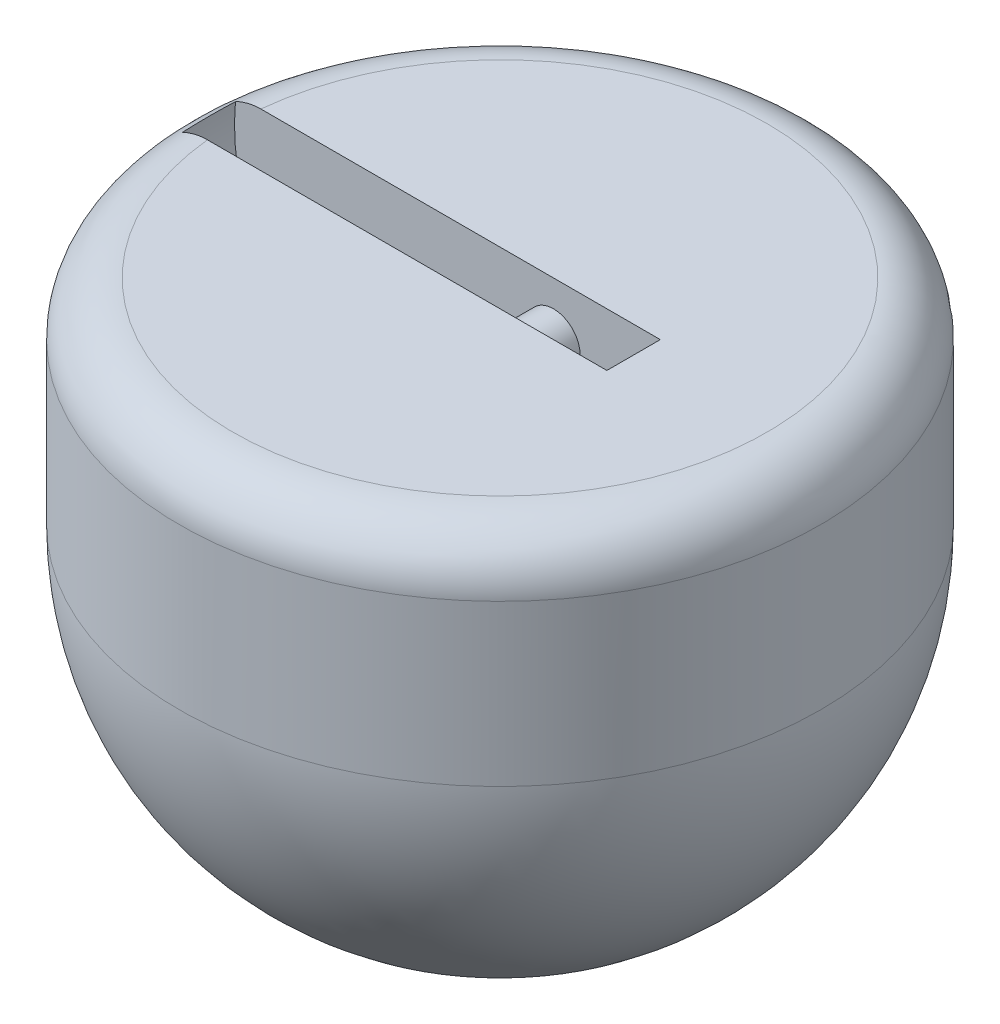
ISO-10303-21;
HEADER;
FILE_DESCRIPTION(('STEP AP214'),'2;1');
FILE_NAME('part.step','',(''),(''),'','','');
FILE_SCHEMA(('AUTOMOTIVE_DESIGN { 1 0 10303 214 1 1 1 1 }'));
ENDSEC;
DATA;
#1=APPLICATION_CONTEXT('core data for automotive mechanical design processes');
#2=APPLICATION_PROTOCOL_DEFINITION('international standard','automotive_design',2000,#1);
#3=PRODUCT_CONTEXT('',#1,'mechanical');
#4=PRODUCT('Part','Part','',(#3));
#5=PRODUCT_RELATED_PRODUCT_CATEGORY('part','',(#4));
#6=PRODUCT_DEFINITION_FORMATION('','',#4);
#7=PRODUCT_DEFINITION_CONTEXT('part definition',#1,'design');
#8=PRODUCT_DEFINITION('design','',#6,#7);
#9=PRODUCT_DEFINITION_SHAPE('','',#8);
#10=(LENGTH_UNIT() NAMED_UNIT(*) SI_UNIT(.MILLI.,.METRE.));
#11=(NAMED_UNIT(*) PLANE_ANGLE_UNIT() SI_UNIT($,.RADIAN.));
#12=(NAMED_UNIT(*) SI_UNIT($,.STERADIAN.) SOLID_ANGLE_UNIT());
#13=UNCERTAINTY_MEASURE_WITH_UNIT(LENGTH_MEASURE(1.E-05),#10,'distance_accuracy_value','');
#14=(GEOMETRIC_REPRESENTATION_CONTEXT(3) GLOBAL_UNCERTAINTY_ASSIGNED_CONTEXT((#13)) GLOBAL_UNIT_ASSIGNED_CONTEXT((#10,
#11,#12)) REPRESENTATION_CONTEXT('',''));
#15=CARTESIAN_POINT('',(0.,0.,0.));
#16=DIRECTION('',(0.,0.,1.));
#17=DIRECTION('',(1.,0.,0.));
#18=AXIS2_PLACEMENT_3D('',#15,#16,#17);
#19=CARTESIAN_POINT('',(0.,0.,0.));
#20=DIRECTION('',(0.,1.,0.));
#21=DIRECTION('',(0.,0.,1.));
#22=AXIS2_PLACEMENT_3D('',#19,#20,#21);
#23=PLANE('',#22);
#24=DIRECTION('',(-1.,0.,0.));
#25=VECTOR('',#24,1.);
#26=CARTESIAN_POINT('',(5.,0.,-1.));
#27=LINE('',#26,#25);
#28=CARTESIAN_POINT('',(5.,0.,-1.));
#29=VERTEX_POINT('',#28);
#30=CARTESIAN_POINT('',(-9.9498743710665,0.,-1.));
#31=VERTEX_POINT('',#30);
#32=EDGE_CURVE('E56',#29,#31,#27,.T.);
#33=ORIENTED_EDGE('',*,*,#32,.F.);
#34=DIRECTION('',(0.,0.,1.));
#35=VECTOR('',#34,1.);
#36=CARTESIAN_POINT('',(5.,0.,-1.));
#37=LINE('',#36,#35);
#38=CARTESIAN_POINT('',(5.,0.,1.));
#39=VERTEX_POINT('',#38);
#40=EDGE_CURVE('E75',#29,#39,#37,.T.);
#41=ORIENTED_EDGE('',*,*,#40,.T.);
#42=DIRECTION('',(-1.,0.,0.));
#43=VECTOR('',#42,1.);
#44=CARTESIAN_POINT('',(5.,0.,1.));
#45=LINE('',#44,#43);
#46=CARTESIAN_POINT('',(-9.9498743710665,0.,1.));
#47=VERTEX_POINT('',#46);
#48=EDGE_CURVE('E72',#39,#47,#45,.T.);
#49=ORIENTED_EDGE('',*,*,#48,.T.);
#50=CARTESIAN_POINT('',(0.,0.,0.));
#51=DIRECTION('',(0.,-1.,0.));
#52=DIRECTION('',(0.,0.,-1.));
#53=AXIS2_PLACEMENT_3D('',#50,#51,#52);
#54=CIRCLE('',#53,10.);
#55=EDGE_CURVE('E83',#31,#47,#54,.T.);
#56=ORIENTED_EDGE('',*,*,#55,.F.);
#57=EDGE_LOOP('',(#33,#41,#49,#56));
#58=FACE_BOUND('',#57,.T.);
#59=ADVANCED_FACE('F34',(#58),#23,.T.);
#60=CARTESIAN_POINT('',(0.,-2.,0.));
#61=DIRECTION('',(0.,-1.,0.));
#62=DIRECTION('',(0.,0.,-1.));
#63=AXIS2_PLACEMENT_3D('',#60,#61,#62);
#64=TOROIDAL_SURFACE('',#63,10.,2.);
#65=CARTESIAN_POINT('',(-10.8242334275043,-0.199297555043121,-1.));
#66=CARTESIAN_POINT('',(-10.9257054604038,-0.248139179035854,-1.));
#67=CARTESIAN_POINT('',(-11.0231377750794,-0.305557934567899,-1.));
#68=CARTESIAN_POINT('',(-11.2070704624869,-0.43597230631444,-1.));
#69=CARTESIAN_POINT('',(-11.2935580682294,-0.508985851904782,-1.));
#70=CARTESIAN_POINT('',(-11.4530114356367,-0.668497793270508,-1.));
#71=CARTESIAN_POINT('',(-11.5259813733455,-0.754992009175932,-1.));
#72=CARTESIAN_POINT('',(-11.6562962836318,-0.939010720145789,-1.));
#73=CARTESIAN_POINT('',(-11.7136451079299,-1.03653248772297,-1.));
#74=CARTESIAN_POINT('',(-11.8109532091549,-1.23958249116003,-1.));
#75=CARTESIAN_POINT('',(-11.8509577064683,-1.34508905400909,-1.));
#76=CARTESIAN_POINT('',(-11.9126368483875,-1.56133441106516,-1.));
#77=CARTESIAN_POINT('',(-11.9343110800122,-1.67207332309768,-1.));
#78=CARTESIAN_POINT('',(-11.9586679257183,-1.89533704689153,-1.));
#79=CARTESIAN_POINT('',(-11.9613982703355,-2.0078566537947,-1.));
#80=CARTESIAN_POINT('',(-11.9479150153787,-2.23175421810235,-1.));
#81=CARTESIAN_POINT('',(-11.9317015890207,-2.34313218593625,-1.));
#82=CARTESIAN_POINT('',(-11.8808176377737,-2.56150613587524,-1.));
#83=CARTESIAN_POINT('',(-11.8461599659228,-2.66850511367036,-1.));
#84=CARTESIAN_POINT('',(-11.7593943517058,-2.87517577070994,-1.));
#85=CARTESIAN_POINT('',(-11.7072863890297,-2.97484744142617,-1.));
#86=CARTESIAN_POINT('',(-11.5870418223883,-3.16417294238195,-1.));
#87=CARTESIAN_POINT('',(-11.5188855627623,-3.25381428744889,-1.));
#88=CARTESIAN_POINT('',(-11.3685310366841,-3.42042364723295,-1.));
#89=CARTESIAN_POINT('',(-11.2863325809017,-3.4973914910464,-1.));
#90=CARTESIAN_POINT('',(-11.1099756084311,-3.63671625838457,-1.));
#91=CARTESIAN_POINT('',(-11.0157828277439,-3.69902980734676,-1.));
#92=CARTESIAN_POINT('',(-10.818305467045,-3.80703093379937,-1.));
#93=CARTESIAN_POINT('',(-10.7150207083925,-3.85271818452254,-1.));
#94=CARTESIAN_POINT('',(-10.5018541004647,-3.92636375685488,-1.));
#95=CARTESIAN_POINT('',(-10.3919477162282,-3.95425106105585,-1.));
#96=CARTESIAN_POINT('',(-10.1690193431008,-3.99125564685907,-1.));
#97=CARTESIAN_POINT('',(-10.055997282353,-4.00037249519023,-1.));
#98=CARTESIAN_POINT('',(-9.8295847785201,-3.99960269171912,-1.));
#99=CARTESIAN_POINT('',(-9.71619457980172,-3.9896432240721,-1.));
#100=CARTESIAN_POINT('',(-9.49268394558884,-3.95086958948949,-1.));
#101=CARTESIAN_POINT('',(-9.38256356668763,-3.92205509641406,-1.));
#102=CARTESIAN_POINT('',(-9.16849480489789,-3.84630422516719,-1.));
#103=CARTESIAN_POINT('',(-9.06455909718188,-3.79933201621416,-1.));
#104=CARTESIAN_POINT('',(-8.86606359963075,-3.68857952169498,-1.));
#105=CARTESIAN_POINT('',(-8.77150380402485,-3.62479924647412,-1.));
#106=CARTESIAN_POINT('',(-8.59462414757433,-3.48232359469526,-1.));
#107=CARTESIAN_POINT('',(-8.51228531731116,-3.40365177408854,-1.));
#108=CARTESIAN_POINT('',(-8.36207230372604,-3.23353367455121,-1.));
#109=CARTESIAN_POINT('',(-8.29419771704558,-3.14208775196457,-1.));
#110=CARTESIAN_POINT('',(-8.17525446281042,-2.94954629656905,-1.));
#111=CARTESIAN_POINT('',(-8.12409538838126,-2.84850662111941,-1.));
#112=CARTESIAN_POINT('',(-8.03960406066904,-2.63922988469286,-1.));
#113=CARTESIAN_POINT('',(-8.00627103040308,-2.53099313764558,-1.));
#114=CARTESIAN_POINT('',(-7.95860960077374,-2.31120849463868,-1.));
#115=CARTESIAN_POINT('',(-7.9441497273926,-2.19968909982976,-1.));
#116=CARTESIAN_POINT('',(-7.93424044725219,-1.97581043988159,-1.));
#117=CARTESIAN_POINT('',(-7.9387904693458,-1.86345120007649,-1.));
#118=CARTESIAN_POINT('',(-7.96670627296362,-1.64154862165487,-1.));
#119=CARTESIAN_POINT('',(-7.98999775721574,-1.53199592313294,-1.));
#120=CARTESIAN_POINT('',(-8.05460594024829,-1.31834308173638,-1.));
#121=CARTESIAN_POINT('',(-8.09592278107696,-1.21424298183803,-1.));
#122=CARTESIAN_POINT('',(-8.19546499470476,-1.01420355677668,-1.));
#123=CARTESIAN_POINT('',(-8.25372493878907,-0.918281440973528,-1.));
#124=CARTESIAN_POINT('',(-8.38542412717523,-0.737496379449116,-1.));
#125=CARTESIAN_POINT('',(-8.45886389885065,-0.652633818123036,-1.));
#126=CARTESIAN_POINT('',(-8.61934253200508,-0.495786961745805,-1.));
#127=CARTESIAN_POINT('',(-8.70646638718297,-0.423889631940541,-1.));
#128=CARTESIAN_POINT('',(-8.89147968023287,-0.295632238853413,-1.));
#129=CARTESIAN_POINT('',(-8.9893690871969,-0.239272130965685,-1.));
#130=CARTESIAN_POINT('',(-9.1938083834499,-0.143325437428456,-1.));
#131=CARTESIAN_POINT('',(-9.30040918537551,-0.103847319698298,-1.));
#132=CARTESIAN_POINT('',(-9.51874388838062,-0.0432767192851328,-1.));
#133=CARTESIAN_POINT('',(-9.63047915301714,-0.0221891506255669,-1.));
#134=CARTESIAN_POINT('',(-9.85629384700905,0.00103226072303266,-1.));
#135=CARTESIAN_POINT('',(-9.97038017747644,0.00309870617211501,-1.));
#136=CARTESIAN_POINT('',(-10.1971820534755,-0.0119856037720281,-1.));
#137=CARTESIAN_POINT('',(-10.3098990746798,-0.0291133887652928,-1.));
#138=CARTESIAN_POINT('',(-10.4899404810384,-0.0722563206126016,-1.));
#139=CARTESIAN_POINT('',(-10.5586606285797,-0.0926562173305354,-1.));
#140=CARTESIAN_POINT('',(-10.6935428790982,-0.140647066676178,-1.));
#141=CARTESIAN_POINT('',(-10.7597049815847,-0.168238020682936,-1.));
#142=CARTESIAN_POINT('',(-10.8242334275043,-0.199297555043121,-1.));
#143=B_SPLINE_CURVE_WITH_KNOTS('',3,(#65,#66,#67,#68,#69,#70,#71,#72,#73,#74,#75,#76,#77,#78,
#79,#80,#81,#82,#83,#84,#85,#86,#87,#88,#89,#90,#91,#92,#93,#94,#95,#96,#97,#98,#99,#100,#101,
#102,#103,#104,#105,#106,#107,#108,#109,#110,#111,#112,#113,#114,#115,#116,#117,#118,#119,#120,
#121,#122,#123,#124,#125,#126,#127,#128,#129,#130,#131,#132,#133,#134,#135,#136,#137,#138,#139,
#140,#141,#142),.UNSPECIFIED.,.T.,.F.,(4,2,2,2,2,2,2,2,2,2,2,2,2,2,2,2,2,2,2,2,2,2,2,2,2,2,2,2,
2,2,2,2,2,2,2,2,2,2,4),(0.,0.337584164204723,0.675558559432851,1.01342836870058,
1.35121479334807,1.68811516129069,2.02502311939836,2.36108190352256,2.69713761485192,
3.03295944879974,3.36878167360329,3.70501736664955,4.04125759350321,4.37848085670867,
4.7157107472202,5.05427782777901,5.39285272326164,5.73272256248192,6.07259828066687,
6.41314813076086,6.7536977712485,7.09371315366308,7.43371905296525,7.77185433704961,
8.1099748816469,8.44572721593102,8.78146946270047,9.11588723677842,9.45030764627263,
9.78541526441601,10.1205345267371,10.4578241791256,10.7951128631779,11.1345372256506,
11.4740522558177,11.814769823036,12.1550800767718,12.3697577242299,12.5844354128573),.UNSPECIFIED.);
#144=CARTESIAN_POINT('',(-10.9009037574159,-0.238237913015783,-1.));
#145=VERTEX_POINT('',#144);
#146=EDGE_CURVE('E69',#31,#145,#143,.T.);
#147=ORIENTED_EDGE('',*,*,#146,.F.);
#148=ORIENTED_EDGE('',*,*,#55,.T.);
#149=CARTESIAN_POINT('',(-10.8242334275043,-0.199297555043121,1.));
#150=CARTESIAN_POINT('',(-10.9257054604038,-0.248139179035854,1.));
#151=CARTESIAN_POINT('',(-11.0231377750794,-0.305557934567899,1.));
#152=CARTESIAN_POINT('',(-11.2070704624869,-0.43597230631444,1.));
#153=CARTESIAN_POINT('',(-11.2935580682294,-0.508985851904782,1.));
#154=CARTESIAN_POINT('',(-11.4530114356367,-0.668497793270508,1.));
#155=CARTESIAN_POINT('',(-11.5259813733455,-0.754992009175932,1.));
#156=CARTESIAN_POINT('',(-11.6562962836318,-0.939010720145789,1.));
#157=CARTESIAN_POINT('',(-11.7136451079299,-1.03653248772297,1.));
#158=CARTESIAN_POINT('',(-11.8109532091549,-1.23958249116003,1.));
#159=CARTESIAN_POINT('',(-11.8509577064683,-1.34508905400909,1.));
#160=CARTESIAN_POINT('',(-11.9126368483875,-1.56133441106516,1.));
#161=CARTESIAN_POINT('',(-11.9343110800122,-1.67207332309768,1.));
#162=CARTESIAN_POINT('',(-11.9586679257183,-1.89533704689153,1.));
#163=CARTESIAN_POINT('',(-11.9613982703355,-2.0078566537947,1.));
#164=CARTESIAN_POINT('',(-11.9479150153787,-2.23175421810235,1.));
#165=CARTESIAN_POINT('',(-11.9317015890207,-2.34313218593625,1.));
#166=CARTESIAN_POINT('',(-11.8808176377737,-2.56150613587524,1.));
#167=CARTESIAN_POINT('',(-11.8461599659228,-2.66850511367036,1.));
#168=CARTESIAN_POINT('',(-11.7593943517058,-2.87517577070994,1.));
#169=CARTESIAN_POINT('',(-11.7072863890297,-2.97484744142617,1.));
#170=CARTESIAN_POINT('',(-11.5870418223883,-3.16417294238195,1.));
#171=CARTESIAN_POINT('',(-11.5188855627623,-3.25381428744889,1.));
#172=CARTESIAN_POINT('',(-11.3685310366841,-3.42042364723295,1.));
#173=CARTESIAN_POINT('',(-11.2863325809017,-3.4973914910464,1.));
#174=CARTESIAN_POINT('',(-11.1099756084311,-3.63671625838457,1.));
#175=CARTESIAN_POINT('',(-11.0157828277439,-3.69902980734676,1.));
#176=CARTESIAN_POINT('',(-10.818305467045,-3.80703093379937,1.));
#177=CARTESIAN_POINT('',(-10.7150207083925,-3.85271818452254,1.));
#178=CARTESIAN_POINT('',(-10.5018541004647,-3.92636375685488,1.));
#179=CARTESIAN_POINT('',(-10.3919477162282,-3.95425106105585,1.));
#180=CARTESIAN_POINT('',(-10.1690193431008,-3.99125564685907,1.));
#181=CARTESIAN_POINT('',(-10.055997282353,-4.00037249519023,1.));
#182=CARTESIAN_POINT('',(-9.8295847785201,-3.99960269171912,1.));
#183=CARTESIAN_POINT('',(-9.71619457980172,-3.9896432240721,1.));
#184=CARTESIAN_POINT('',(-9.49268394558884,-3.95086958948949,1.));
#185=CARTESIAN_POINT('',(-9.38256356668763,-3.92205509641406,1.));
#186=CARTESIAN_POINT('',(-9.16849480489789,-3.84630422516719,1.));
#187=CARTESIAN_POINT('',(-9.06455909718188,-3.79933201621416,1.));
#188=CARTESIAN_POINT('',(-8.86606359963075,-3.68857952169498,1.));
#189=CARTESIAN_POINT('',(-8.77150380402485,-3.62479924647412,1.));
#190=CARTESIAN_POINT('',(-8.59462414757433,-3.48232359469526,1.));
#191=CARTESIAN_POINT('',(-8.51228531731116,-3.40365177408854,1.));
#192=CARTESIAN_POINT('',(-8.36207230372604,-3.23353367455121,1.));
#193=CARTESIAN_POINT('',(-8.29419771704558,-3.14208775196457,1.));
#194=CARTESIAN_POINT('',(-8.17525446281042,-2.94954629656905,1.));
#195=CARTESIAN_POINT('',(-8.12409538838126,-2.84850662111941,1.));
#196=CARTESIAN_POINT('',(-8.03960406066904,-2.63922988469286,1.));
#197=CARTESIAN_POINT('',(-8.00627103040308,-2.53099313764558,1.));
#198=CARTESIAN_POINT('',(-7.95860960077374,-2.31120849463868,1.));
#199=CARTESIAN_POINT('',(-7.9441497273926,-2.19968909982976,1.));
#200=CARTESIAN_POINT('',(-7.93424044725219,-1.97581043988159,1.));
#201=CARTESIAN_POINT('',(-7.9387904693458,-1.86345120007649,1.));
#202=CARTESIAN_POINT('',(-7.96670627296362,-1.64154862165487,1.));
#203=CARTESIAN_POINT('',(-7.98999775721574,-1.53199592313294,1.));
#204=CARTESIAN_POINT('',(-8.05460594024829,-1.31834308173638,1.));
#205=CARTESIAN_POINT('',(-8.09592278107696,-1.21424298183803,1.));
#206=CARTESIAN_POINT('',(-8.19546499470476,-1.01420355677668,1.));
#207=CARTESIAN_POINT('',(-8.25372493878907,-0.918281440973528,1.));
#208=CARTESIAN_POINT('',(-8.38542412717523,-0.737496379449116,1.));
#209=CARTESIAN_POINT('',(-8.45886389885065,-0.652633818123036,1.));
#210=CARTESIAN_POINT('',(-8.61934253200508,-0.495786961745805,1.));
#211=CARTESIAN_POINT('',(-8.70646638718297,-0.423889631940541,1.));
#212=CARTESIAN_POINT('',(-8.89147968023287,-0.295632238853413,1.));
#213=CARTESIAN_POINT('',(-8.9893690871969,-0.239272130965685,1.));
#214=CARTESIAN_POINT('',(-9.1938083834499,-0.143325437428456,1.));
#215=CARTESIAN_POINT('',(-9.30040918537551,-0.103847319698298,1.));
#216=CARTESIAN_POINT('',(-9.51874388838062,-0.0432767192851328,1.));
#217=CARTESIAN_POINT('',(-9.63047915301714,-0.0221891506255669,1.));
#218=CARTESIAN_POINT('',(-9.85629384700905,0.00103226072303266,1.));
#219=CARTESIAN_POINT('',(-9.97038017747644,0.00309870617211501,1.));
#220=CARTESIAN_POINT('',(-10.1971820534755,-0.0119856037720281,1.));
#221=CARTESIAN_POINT('',(-10.3098990746798,-0.0291133887652928,1.));
#222=CARTESIAN_POINT('',(-10.4899404810384,-0.0722563206126016,1.));
#223=CARTESIAN_POINT('',(-10.5586606285797,-0.0926562173305354,1.));
#224=CARTESIAN_POINT('',(-10.6935428790982,-0.140647066676178,1.));
#225=CARTESIAN_POINT('',(-10.7597049815847,-0.168238020682936,1.));
#226=CARTESIAN_POINT('',(-10.8242334275043,-0.199297555043121,1.));
#227=B_SPLINE_CURVE_WITH_KNOTS('',3,(#149,#150,#151,#152,#153,#154,#155,#156,#157,#158,#159,
#160,#161,#162,#163,#164,#165,#166,#167,#168,#169,#170,#171,#172,#173,#174,#175,#176,#177,#178,
#179,#180,#181,#182,#183,#184,#185,#186,#187,#188,#189,#190,#191,#192,#193,#194,#195,#196,#197,
#198,#199,#200,#201,#202,#203,#204,#205,#206,#207,#208,#209,#210,#211,#212,#213,#214,#215,#216,
#217,#218,#219,#220,#221,#222,#223,#224,#225,#226),.UNSPECIFIED.,.T.,.F.,(4,2,2,2,2,2,2,2,2,2,2,
2,2,2,2,2,2,2,2,2,2,2,2,2,2,2,2,2,2,2,2,2,2,2,2,2,2,2,4),(0.,0.337584164204723,
0.675558559432851,1.01342836870058,1.35121479334807,1.68811516129069,2.02502311939836,
2.36108190352256,2.69713761485192,3.03295944879974,3.36878167360329,3.70501736664955,
4.04125759350321,4.37848085670867,4.7157107472202,5.05427782777901,5.39285272326164,
5.73272256248192,6.07259828066687,6.41314813076086,6.7536977712485,7.09371315366308,
7.43371905296525,7.77185433704961,8.1099748816469,8.44572721593102,8.78146946270047,
9.11588723677842,9.45030764627263,9.78541526441601,10.1205345267371,10.4578241791256,
10.7951128631779,11.1345372256506,11.4740522558177,11.814769823036,12.1550800767718,
12.3697577242299,12.5844354128573),.UNSPECIFIED.);
#228=CARTESIAN_POINT('',(-10.9009037574019,-0.23823791301712,1.));
#229=VERTEX_POINT('',#228);
#230=EDGE_CURVE('E96',#47,#229,#227,.T.);
#231=ORIENTED_EDGE('',*,*,#230,.T.);
#232=CARTESIAN_POINT('',(-10.9009047472752,-0.23824826132108,-1.00019999999998));
#233=CARTESIAN_POINT('',(-10.9004924890538,-0.233941136466965,-0.916897984341462));
#234=CARTESIAN_POINT('',(-10.9001343628179,-0.230230968095761,-0.833566643638268));
#235=CARTESIAN_POINT('',(-10.8995233481884,-0.223935137376225,-0.666862660351941));
#236=CARTESIAN_POINT('',(-10.899270457638,-0.221349451983728,-0.583490018650251));
#237=CARTESIAN_POINT('',(-10.8986653396194,-0.215177450640901,-0.333438906791319));
#238=CARTESIAN_POINT('',(-10.8984661404369,-0.213170798646531,-0.166719453395659));
#239=CARTESIAN_POINT('',(-10.8984661404369,-0.213170798646531,0.166719453395659));
#240=CARTESIAN_POINT('',(-10.8986653396194,-0.215177450640901,0.333438906791319));
#241=CARTESIAN_POINT('',(-10.899270457638,-0.221349451983728,0.583490018650251));
#242=CARTESIAN_POINT('',(-10.8995233481884,-0.223935137376224,0.666862660351941));
#243=CARTESIAN_POINT('',(-10.9001343628179,-0.230230968095761,0.833566643638268));
#244=CARTESIAN_POINT('',(-10.9004924890538,-0.233941136466966,0.916897984341462));
#245=CARTESIAN_POINT('',(-10.9009047472752,-0.238248261321081,1.00019999999998));
#246=B_SPLINE_CURVE_WITH_KNOTS('',3,(#232,#233,#234,#235,#236,#237,#238,#239,#240,#241,#242,
#243,#244,#245),.UNSPECIFIED.,.F.,.F.,(4,2,2,2,2,2,4),(0.,0.250237729780698,0.500470331168158,
1.00061183689406,1.50075334261997,1.75098594400743,2.00122367378813),.UNSPECIFIED.);
#247=EDGE_CURVE('E103',#145,#229,#246,.T.);
#248=ORIENTED_EDGE('',*,*,#247,.F.);
#249=EDGE_LOOP('',(#147,#148,#231,#248));
#250=FACE_BOUND('',#249,.T.);
#251=CARTESIAN_POINT('',(0.,-2.,0.));
#252=DIRECTION('',(0.,-1.,0.));
#253=DIRECTION('',(0.,0.,-1.));
#254=AXIS2_PLACEMENT_3D('',#251,#252,#253);
#255=CIRCLE('',#254,12.);
#256=CARTESIAN_POINT('',(0.,-2.,-12.));
#257=VERTEX_POINT('',#256);
#258=EDGE_CURVE('E92',#257,#257,#255,.T.);
#259=ORIENTED_EDGE('',*,*,#258,.F.);
#260=EDGE_LOOP('',(#259));
#261=FACE_BOUND('',#260,.T.);
#262=ADVANCED_FACE('F110',(#250,#261),#64,.T.);
#263=CARTESIAN_POINT('',(0.,-20.,0.));
#264=DIRECTION('',(0.,-1.,0.));
#265=DIRECTION('',(0.,0.,-1.));
#266=AXIS2_PLACEMENT_3D('',#263,#264,#265);
#267=CYLINDRICAL_SURFACE('',#266,12.);
#268=ORIENTED_EDGE('',*,*,#258,.T.);
#269=EDGE_LOOP('',(#268));
#270=FACE_BOUND('',#269,.T.);
#271=CARTESIAN_POINT('',(0.,-8.,0.));
#272=DIRECTION('',(0.,-1.,0.));
#273=DIRECTION('',(0.,0.,-1.));
#274=AXIS2_PLACEMENT_3D('',#271,#272,#273);
#275=CIRCLE('',#274,12.);
#276=CARTESIAN_POINT('',(0.,-8.,-12.));
#277=VERTEX_POINT('',#276);
#278=EDGE_CURVE('E79',#277,#277,#275,.T.);
#279=ORIENTED_EDGE('',*,*,#278,.F.);
#280=EDGE_LOOP('',(#279));
#281=FACE_BOUND('',#280,.T.);
#282=ADVANCED_FACE('F126',(#270,#281),#267,.T.);
#283=CARTESIAN_POINT('',(0.,-8.,0.));
#284=DIRECTION('',(0.,-1.,0.));
#285=DIRECTION('',(1.,0.,0.));
#286=AXIS2_PLACEMENT_3D('',#283,#284,#285);
#287=SPHERICAL_SURFACE('',#286,12.);
#288=ORIENTED_EDGE('',*,*,#278,.T.);
#289=EDGE_LOOP('',(#288));
#290=FACE_BOUND('',#289,.T.);
#291=ADVANCED_FACE('F124',(#290),#287,.T.);
#292=CARTESIAN_POINT('',(-2.93725393319377,-1.,-1.));
#293=DIRECTION('',(0.,0.,1.));
#294=DIRECTION('',(1.,0.,0.));
#295=AXIS2_PLACEMENT_3D('',#292,#293,#294);
#296=CYLINDRICAL_SURFACE('',#295,8.);
#297=ORIENTED_EDGE('',*,*,#247,.T.);
#298=CARTESIAN_POINT('',(-2.93725393319377,-1.,1.));
#299=DIRECTION('',(0.,0.,1.));
#300=DIRECTION('',(-1.,0.,0.));
#301=AXIS2_PLACEMENT_3D('',#298,#299,#300);
#302=CIRCLE('',#301,8.);
#303=EDGE_CURVE('E48',#229,#39,#302,.T.);
#304=ORIENTED_EDGE('',*,*,#303,.T.);
#305=ORIENTED_EDGE('',*,*,#40,.F.);
#306=CARTESIAN_POINT('',(-2.93725393319377,-1.,-1.));
#307=DIRECTION('',(0.,0.,1.));
#308=DIRECTION('',(-1.,0.,0.));
#309=AXIS2_PLACEMENT_3D('',#306,#307,#308);
#310=CIRCLE('',#309,8.);
#311=EDGE_CURVE('E66',#145,#29,#310,.T.);
#312=ORIENTED_EDGE('',*,*,#311,.F.);
#313=EDGE_LOOP('',(#297,#304,#305,#312));
#314=FACE_BOUND('',#313,.T.);
#315=ADVANCED_FACE('F76',(#314),#296,.F.);
#316=CARTESIAN_POINT('',(-2.93725393319377,-1.,-1.));
#317=DIRECTION('',(0.,0.,-1.));
#318=DIRECTION('',(-1.,0.,0.));
#319=AXIS2_PLACEMENT_3D('',#316,#317,#318);
#320=PLANE('',#319);
#321=CARTESIAN_POINT('',(-3.,-5.,-1.));
#322=DIRECTION('',(0.,0.,-1.));
#323=DIRECTION('',(-1.,0.,0.));
#324=AXIS2_PLACEMENT_3D('',#321,#322,#323);
#325=CIRCLE('',#324,1.);
#326=CARTESIAN_POINT('',(-4.,-5.,-1.));
#327=VERTEX_POINT('',#326);
#328=EDGE_CURVE('E11',#327,#327,#325,.F.);
#329=ORIENTED_EDGE('',*,*,#328,.F.);
#330=EDGE_LOOP('',(#329));
#331=FACE_BOUND('',#330,.T.);
#332=CARTESIAN_POINT('',(1.,-2.,-1.));
#333=DIRECTION('',(0.,0.,-1.));
#334=DIRECTION('',(-1.,0.,0.));
#335=AXIS2_PLACEMENT_3D('',#332,#333,#334);
#336=CIRCLE('',#335,1.);
#337=CARTESIAN_POINT('',(0.,-2.,-1.));
#338=VERTEX_POINT('',#337);
#339=EDGE_CURVE('E41',#338,#338,#336,.F.);
#340=ORIENTED_EDGE('',*,*,#339,.F.);
#341=EDGE_LOOP('',(#340));
#342=FACE_BOUND('',#341,.T.);
#343=ORIENTED_EDGE('',*,*,#146,.T.);
#344=ORIENTED_EDGE('',*,*,#311,.T.);
#345=ORIENTED_EDGE('',*,*,#32,.T.);
#346=EDGE_LOOP('',(#343,#344,#345));
#347=FACE_BOUND('',#346,.T.);
#348=ADVANCED_FACE('F68',(#331,#342,#347),#320,.F.);
#349=CARTESIAN_POINT('',(-2.93725393319377,-1.,1.));
#350=DIRECTION('',(0.,0.,-1.));
#351=DIRECTION('',(-1.,0.,0.));
#352=AXIS2_PLACEMENT_3D('',#349,#350,#351);
#353=PLANE('',#352);
#354=CARTESIAN_POINT('',(-3.,-5.,1.));
#355=DIRECTION('',(0.,0.,1.));
#356=DIRECTION('',(1.,0.,0.));
#357=AXIS2_PLACEMENT_3D('',#354,#355,#356);
#358=CIRCLE('',#357,1.);
#359=CARTESIAN_POINT('',(-2.,-5.,1.));
#360=VERTEX_POINT('',#359);
#361=EDGE_CURVE('E190',#360,#360,#358,.T.);
#362=ORIENTED_EDGE('',*,*,#361,.T.);
#363=EDGE_LOOP('',(#362));
#364=FACE_BOUND('',#363,.T.);
#365=CARTESIAN_POINT('',(1.,-2.,1.));
#366=DIRECTION('',(0.,0.,1.));
#367=DIRECTION('',(1.,0.,0.));
#368=AXIS2_PLACEMENT_3D('',#365,#366,#367);
#369=CIRCLE('',#368,1.);
#370=CARTESIAN_POINT('',(2.,-2.,1.));
#371=VERTEX_POINT('',#370);
#372=EDGE_CURVE('E88',#371,#371,#369,.T.);
#373=ORIENTED_EDGE('',*,*,#372,.T.);
#374=EDGE_LOOP('',(#373));
#375=FACE_BOUND('',#374,.T.);
#376=ORIENTED_EDGE('',*,*,#48,.F.);
#377=ORIENTED_EDGE('',*,*,#303,.F.);
#378=ORIENTED_EDGE('',*,*,#230,.F.);
#379=EDGE_LOOP('',(#376,#377,#378));
#380=FACE_BOUND('',#379,.T.);
#381=ADVANCED_FACE('F113',(#364,#375,#380),#353,.T.);
#382=CARTESIAN_POINT('',(1.,-2.,1.));
#383=DIRECTION('',(0.,0.,-1.));
#384=DIRECTION('',(-1.,0.,0.));
#385=AXIS2_PLACEMENT_3D('',#382,#383,#384);
#386=CYLINDRICAL_SURFACE('',#385,1.);
#387=ORIENTED_EDGE('',*,*,#372,.F.);
#388=EDGE_LOOP('',(#387));
#389=FACE_BOUND('',#388,.T.);
#390=ORIENTED_EDGE('',*,*,#339,.T.);
#391=EDGE_LOOP('',(#390));
#392=FACE_BOUND('',#391,.T.);
#393=ADVANCED_FACE('F117',(#389,#392),#386,.T.);
#394=CARTESIAN_POINT('',(-3.,-5.,1.));
#395=DIRECTION('',(0.,0.,-1.));
#396=DIRECTION('',(-1.,0.,0.));
#397=AXIS2_PLACEMENT_3D('',#394,#395,#396);
#398=CYLINDRICAL_SURFACE('',#397,1.);
#399=ORIENTED_EDGE('',*,*,#361,.F.);
#400=EDGE_LOOP('',(#399));
#401=FACE_BOUND('',#400,.T.);
#402=ORIENTED_EDGE('',*,*,#328,.T.);
#403=EDGE_LOOP('',(#402));
#404=FACE_BOUND('',#403,.T.);
#405=ADVANCED_FACE('F174',(#401,#404),#398,.T.);
#406=CLOSED_SHELL('',(#59,#262,#282,#291,#315,#348,#381,#393,#405));
#407=MANIFOLD_SOLID_BREP('B2',#406);
#408=ADVANCED_BREP_SHAPE_REPRESENTATION('',(#18,#407),#14);
#409=SHAPE_DEFINITION_REPRESENTATION(#9,#408);
ENDSEC;
END-ISO-10303-21;
